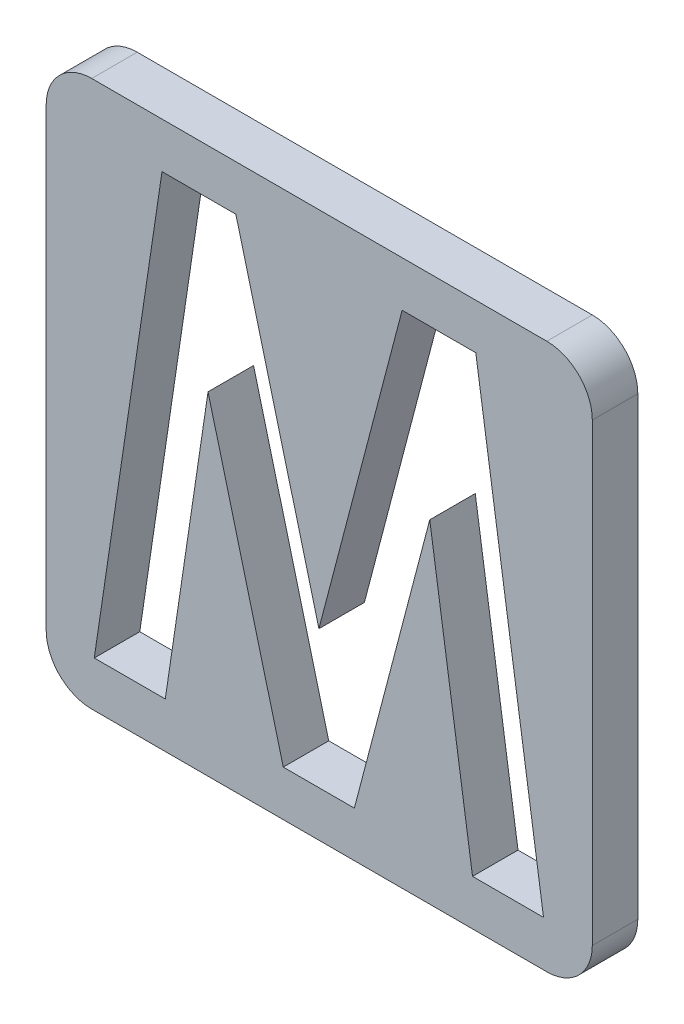
ISO-10303-21;
HEADER;
FILE_DESCRIPTION(('STEP AP214'),'2;1');
FILE_NAME('part.step','',(''),(''),'','','');
FILE_SCHEMA(('AUTOMOTIVE_DESIGN { 1 0 10303 214 1 1 1 1 }'));
ENDSEC;
DATA;
#1=APPLICATION_CONTEXT('core data for automotive mechanical design processes');
#2=APPLICATION_PROTOCOL_DEFINITION('international standard','automotive_design',2000,#1);
#3=PRODUCT_CONTEXT('',#1,'mechanical');
#4=PRODUCT('Part','Part','',(#3));
#5=PRODUCT_RELATED_PRODUCT_CATEGORY('part','',(#4));
#6=PRODUCT_DEFINITION_FORMATION('','',#4);
#7=PRODUCT_DEFINITION_CONTEXT('part definition',#1,'design');
#8=PRODUCT_DEFINITION('design','',#6,#7);
#9=PRODUCT_DEFINITION_SHAPE('','',#8);
#10=(LENGTH_UNIT() NAMED_UNIT(*) SI_UNIT(.MILLI.,.METRE.));
#11=(NAMED_UNIT(*) PLANE_ANGLE_UNIT() SI_UNIT($,.RADIAN.));
#12=(NAMED_UNIT(*) SI_UNIT($,.STERADIAN.) SOLID_ANGLE_UNIT());
#13=UNCERTAINTY_MEASURE_WITH_UNIT(LENGTH_MEASURE(1.E-05),#10,'distance_accuracy_value','');
#14=(GEOMETRIC_REPRESENTATION_CONTEXT(3) GLOBAL_UNCERTAINTY_ASSIGNED_CONTEXT((#13)) GLOBAL_UNIT_ASSIGNED_CONTEXT((#10,
#11,#12)) REPRESENTATION_CONTEXT('',''));
#15=CARTESIAN_POINT('',(0.,0.,0.));
#16=DIRECTION('',(0.,0.,1.));
#17=DIRECTION('',(1.,0.,0.));
#18=AXIS2_PLACEMENT_3D('',#15,#16,#17);
#19=CARTESIAN_POINT('',(50.,50.,10.));
#20=DIRECTION('',(0.,0.,-1.));
#21=DIRECTION('',(-1.,0.,0.));
#22=AXIS2_PLACEMENT_3D('',#19,#20,#21);
#23=PLANE('',#22);
#24=DIRECTION('',(1.,0.,0.));
#25=VECTOR('',#24,1.);
#26=CARTESIAN_POINT('',(-49.9999999999999,60.,10.));
#27=LINE('',#26,#25);
#28=CARTESIAN_POINT('',(-49.9999999999999,60.,10.));
#29=VERTEX_POINT('',#28);
#30=CARTESIAN_POINT('',(49.9999999999999,60.,10.));
#31=VERTEX_POINT('',#30);
#32=EDGE_CURVE('E278',#29,#31,#27,.T.);
#33=ORIENTED_EDGE('',*,*,#32,.F.);
#34=CARTESIAN_POINT('',(-50.,50.,10.));
#35=DIRECTION('',(0.,0.,1.));
#36=DIRECTION('',(1.,0.,0.));
#37=AXIS2_PLACEMENT_3D('',#34,#35,#36);
#38=CIRCLE('',#37,10.);
#39=CARTESIAN_POINT('',(-60.,49.9999999999999,10.));
#40=VERTEX_POINT('',#39);
#41=EDGE_CURVE('E296',#29,#40,#38,.T.);
#42=ORIENTED_EDGE('',*,*,#41,.T.);
#43=DIRECTION('',(0.,-1.,0.));
#44=VECTOR('',#43,1.);
#45=CARTESIAN_POINT('',(-60.,49.9999999999999,10.));
#46=LINE('',#45,#44);
#47=CARTESIAN_POINT('',(-60.,-49.9999999999999,10.));
#48=VERTEX_POINT('',#47);
#49=EDGE_CURVE('E294',#40,#48,#46,.T.);
#50=ORIENTED_EDGE('',*,*,#49,.T.);
#51=CARTESIAN_POINT('',(-50.,-50.,10.));
#52=DIRECTION('',(0.,0.,1.));
#53=DIRECTION('',(1.,0.,0.));
#54=AXIS2_PLACEMENT_3D('',#51,#52,#53);
#55=CIRCLE('',#54,10.);
#56=CARTESIAN_POINT('',(-49.9999999999999,-60.,10.));
#57=VERTEX_POINT('',#56);
#58=EDGE_CURVE('E292',#48,#57,#55,.T.);
#59=ORIENTED_EDGE('',*,*,#58,.T.);
#60=DIRECTION('',(1.,0.,0.));
#61=VECTOR('',#60,1.);
#62=CARTESIAN_POINT('',(-49.9999999999999,-60.,10.));
#63=LINE('',#62,#61);
#64=CARTESIAN_POINT('',(49.9999999999999,-60.,10.));
#65=VERTEX_POINT('',#64);
#66=EDGE_CURVE('E290',#57,#65,#63,.T.);
#67=ORIENTED_EDGE('',*,*,#66,.T.);
#68=CARTESIAN_POINT('',(50.,-50.,10.));
#69=DIRECTION('',(0.,0.,1.));
#70=DIRECTION('',(1.,0.,0.));
#71=AXIS2_PLACEMENT_3D('',#68,#69,#70);
#72=CIRCLE('',#71,10.);
#73=CARTESIAN_POINT('',(60.,-50.,10.));
#74=VERTEX_POINT('',#73);
#75=EDGE_CURVE('E288',#65,#74,#72,.T.);
#76=ORIENTED_EDGE('',*,*,#75,.T.);
#77=DIRECTION('',(0.,-1.,0.));
#78=VECTOR('',#77,1.);
#79=CARTESIAN_POINT('',(60.,49.9999999999999,10.));
#80=LINE('',#79,#78);
#81=CARTESIAN_POINT('',(60.,49.9999999999999,10.));
#82=VERTEX_POINT('',#81);
#83=EDGE_CURVE('E285',#82,#74,#80,.T.);
#84=ORIENTED_EDGE('',*,*,#83,.F.);
#85=CARTESIAN_POINT('',(50.,50.,10.));
#86=DIRECTION('',(0.,0.,-1.));
#87=DIRECTION('',(-1.,0.,0.));
#88=AXIS2_PLACEMENT_3D('',#85,#86,#87);
#89=CIRCLE('',#88,10.);
#90=EDGE_CURVE('E281',#31,#82,#89,.T.);
#91=ORIENTED_EDGE('',*,*,#90,.F.);
#92=EDGE_LOOP('',(#33,#42,#50,#59,#67,#76,#84,#91));
#93=FACE_BOUND('',#92,.T.);
#94=DIRECTION('',(0.147216445436516,0.989104300967819,0.));
#95=VECTOR('',#94,1.);
#96=CARTESIAN_POINT('',(-49.4358974358974,-50.,10.));
#97=LINE('',#96,#95);
#98=CARTESIAN_POINT('',(-49.4358974358974,-50.,10.));
#99=VERTEX_POINT('',#98);
#100=CARTESIAN_POINT('',(-34.5520833333333,50.,10.));
#101=VERTEX_POINT('',#100);
#102=EDGE_CURVE('E50',#99,#101,#97,.T.);
#103=ORIENTED_EDGE('',*,*,#102,.T.);
#104=DIRECTION('',(1.,0.,0.));
#105=VECTOR('',#104,1.);
#106=CARTESIAN_POINT('',(-34.5520833333333,50.,10.));
#107=LINE('',#106,#105);
#108=CARTESIAN_POINT('',(-18.3261217948718,50.,10.));
#109=VERTEX_POINT('',#108);
#110=EDGE_CURVE('E192',#101,#109,#107,.T.);
#111=ORIENTED_EDGE('',*,*,#110,.T.);
#112=DIRECTION('',(0.253111760027982,-0.967437045463702,0.));
#113=VECTOR('',#112,1.);
#114=CARTESIAN_POINT('',(-18.3261217948718,50.,10.));
#115=LINE('',#114,#113);
#116=CARTESIAN_POINT('',(-0.0769230769230717,-19.7516025641026,10.));
#117=VERTEX_POINT('',#116);
#118=EDGE_CURVE('E225',#109,#117,#115,.T.);
#119=ORIENTED_EDGE('',*,*,#118,.T.);
#120=DIRECTION('',(0.253631729312339,0.967300855931614,0.));
#121=VECTOR('',#120,1.);
#122=CARTESIAN_POINT('',(-0.0769230769230717,-19.7516025641026,10.));
#123=LINE('',#122,#121);
#124=CARTESIAN_POINT('',(18.2123397435897,50.,10.));
#125=VERTEX_POINT('',#124);
#126=EDGE_CURVE('E228',#117,#125,#123,.T.);
#127=ORIENTED_EDGE('',*,*,#126,.T.);
#128=DIRECTION('',(1.,0.,0.));
#129=VECTOR('',#128,1.);
#130=CARTESIAN_POINT('',(18.2123397435897,50.,10.));
#131=LINE('',#130,#129);
#132=CARTESIAN_POINT('',(34.3982371794872,50.,10.));
#133=VERTEX_POINT('',#132);
#134=EDGE_CURVE('E231',#125,#133,#131,.T.);
#135=ORIENTED_EDGE('',*,*,#134,.T.);
#136=DIRECTION('',(0.147216445436516,-0.989104300967819,0.));
#137=VECTOR('',#136,1.);
#138=CARTESIAN_POINT('',(34.3982371794872,50.,10.));
#139=LINE('',#138,#137);
#140=CARTESIAN_POINT('',(49.2820512820513,-50.,10.));
#141=VERTEX_POINT('',#140);
#142=EDGE_CURVE('E234',#133,#141,#139,.T.);
#143=ORIENTED_EDGE('',*,*,#142,.T.);
#144=DIRECTION('',(-1.,0.,0.));
#145=VECTOR('',#144,1.);
#146=CARTESIAN_POINT('',(49.2820512820513,-50.,10.));
#147=LINE('',#146,#145);
#148=CARTESIAN_POINT('',(33.6770833333333,-50.,10.));
#149=VERTEX_POINT('',#148);
#150=EDGE_CURVE('E237',#141,#149,#147,.T.);
#151=ORIENTED_EDGE('',*,*,#150,.T.);
#152=DIRECTION('',(-0.147128467052664,0.989117391507567,0.));
#153=VECTOR('',#152,1.);
#154=CARTESIAN_POINT('',(33.6770833333333,-50.,10.));
#155=LINE('',#154,#153);
#156=CARTESIAN_POINT('',(24.2820512820513,13.1610576923077,10.));
#157=VERTEX_POINT('',#156);
#158=EDGE_CURVE('E240',#149,#157,#155,.T.);
#159=ORIENTED_EDGE('',*,*,#158,.T.);
#160=DIRECTION('',(-0.253707982893475,-0.967280858601122,0.));
#161=VECTOR('',#160,1.);
#162=CARTESIAN_POINT('',(24.2820512820513,13.1610576923077,10.));
#163=LINE('',#162,#161);
#164=CARTESIAN_POINT('',(7.71554487179488,-50.,10.));
#165=VERTEX_POINT('',#164);
#166=EDGE_CURVE('E243',#157,#165,#163,.T.);
#167=ORIENTED_EDGE('',*,*,#166,.T.);
#168=DIRECTION('',(-1.,0.,0.));
#169=VECTOR('',#168,1.);
#170=CARTESIAN_POINT('',(7.71554487179488,-50.,10.));
#171=LINE('',#170,#169);
#172=CARTESIAN_POINT('',(-7.90945512820512,-50.,10.));
#173=VERTEX_POINT('',#172);
#174=EDGE_CURVE('E246',#165,#173,#171,.T.);
#175=ORIENTED_EDGE('',*,*,#174,.T.);
#176=DIRECTION('',(-0.253133780305343,0.967431284003327,0.));
#177=VECTOR('',#176,1.);
#178=CARTESIAN_POINT('',(-7.90945512820512,-50.,10.));
#179=LINE('',#178,#177);
#180=CARTESIAN_POINT('',(-24.4358974358974,13.1610576923077,10.));
#181=VERTEX_POINT('',#180);
#182=EDGE_CURVE('E249',#173,#181,#179,.T.);
#183=ORIENTED_EDGE('',*,*,#182,.T.);
#184=DIRECTION('',(-0.147128467052664,-0.989117391507567,0.));
#185=VECTOR('',#184,1.);
#186=CARTESIAN_POINT('',(-24.4358974358974,13.1610576923077,10.));
#187=LINE('',#186,#185);
#188=CARTESIAN_POINT('',(-33.8309294871795,-50.,10.));
#189=VERTEX_POINT('',#188);
#190=EDGE_CURVE('E252',#181,#189,#187,.T.);
#191=ORIENTED_EDGE('',*,*,#190,.T.);
#192=DIRECTION('',(-1.,0.,0.));
#193=VECTOR('',#192,1.);
#194=CARTESIAN_POINT('',(-33.8309294871795,-50.,10.));
#195=LINE('',#194,#193);
#196=EDGE_CURVE('E186',#189,#99,#195,.T.);
#197=ORIENTED_EDGE('',*,*,#196,.T.);
#198=EDGE_LOOP('',(#103,#111,#119,#127,#135,#143,#151,#159,#167,#175,#183,#191,#197));
#199=FACE_BOUND('',#198,.T.);
#200=ADVANCED_FACE('F33',(#93,#199),#23,.F.);
#201=CARTESIAN_POINT('',(50.,50.,0.));
#202=DIRECTION('',(0.,0.,-1.));
#203=DIRECTION('',(-1.,0.,0.));
#204=AXIS2_PLACEMENT_3D('',#201,#202,#203);
#205=PLANE('',#204);
#206=DIRECTION('',(1.,0.,0.));
#207=VECTOR('',#206,1.);
#208=CARTESIAN_POINT('',(-49.9999999999999,60.,0.));
#209=LINE('',#208,#207);
#210=CARTESIAN_POINT('',(-49.9999999999999,60.,0.));
#211=VERTEX_POINT('',#210);
#212=CARTESIAN_POINT('',(49.9999999999999,60.,0.));
#213=VERTEX_POINT('',#212);
#214=EDGE_CURVE('E193',#211,#213,#209,.T.);
#215=ORIENTED_EDGE('',*,*,#214,.T.);
#216=CARTESIAN_POINT('',(50.,50.,0.));
#217=DIRECTION('',(0.,0.,-1.));
#218=DIRECTION('',(-1.,0.,0.));
#219=AXIS2_PLACEMENT_3D('',#216,#217,#218);
#220=CIRCLE('',#219,10.);
#221=CARTESIAN_POINT('',(60.,49.9999999999999,0.));
#222=VERTEX_POINT('',#221);
#223=EDGE_CURVE('E300',#213,#222,#220,.T.);
#224=ORIENTED_EDGE('',*,*,#223,.T.);
#225=DIRECTION('',(0.,-1.,0.));
#226=VECTOR('',#225,1.);
#227=CARTESIAN_POINT('',(60.,49.9999999999999,0.));
#228=LINE('',#227,#226);
#229=CARTESIAN_POINT('',(60.,-50.,0.));
#230=VERTEX_POINT('',#229);
#231=EDGE_CURVE('E303',#222,#230,#228,.T.);
#232=ORIENTED_EDGE('',*,*,#231,.T.);
#233=CARTESIAN_POINT('',(50.,-50.,0.));
#234=DIRECTION('',(0.,0.,1.));
#235=DIRECTION('',(1.,0.,0.));
#236=AXIS2_PLACEMENT_3D('',#233,#234,#235);
#237=CIRCLE('',#236,10.);
#238=CARTESIAN_POINT('',(49.9999999999999,-60.,0.));
#239=VERTEX_POINT('',#238);
#240=EDGE_CURVE('E306',#239,#230,#237,.T.);
#241=ORIENTED_EDGE('',*,*,#240,.F.);
#242=DIRECTION('',(1.,0.,0.));
#243=VECTOR('',#242,1.);
#244=CARTESIAN_POINT('',(-49.9999999999999,-60.,0.));
#245=LINE('',#244,#243);
#246=CARTESIAN_POINT('',(-49.9999999999999,-60.,0.));
#247=VERTEX_POINT('',#246);
#248=EDGE_CURVE('E309',#247,#239,#245,.T.);
#249=ORIENTED_EDGE('',*,*,#248,.F.);
#250=CARTESIAN_POINT('',(-50.,-50.,0.));
#251=DIRECTION('',(0.,0.,1.));
#252=DIRECTION('',(1.,0.,0.));
#253=AXIS2_PLACEMENT_3D('',#250,#251,#252);
#254=CIRCLE('',#253,10.);
#255=CARTESIAN_POINT('',(-60.,-49.9999999999999,0.));
#256=VERTEX_POINT('',#255);
#257=EDGE_CURVE('E311',#256,#247,#254,.T.);
#258=ORIENTED_EDGE('',*,*,#257,.F.);
#259=DIRECTION('',(0.,-1.,0.));
#260=VECTOR('',#259,1.);
#261=CARTESIAN_POINT('',(-60.,49.9999999999999,0.));
#262=LINE('',#261,#260);
#263=CARTESIAN_POINT('',(-60.,49.9999999999999,0.));
#264=VERTEX_POINT('',#263);
#265=EDGE_CURVE('E313',#264,#256,#262,.T.);
#266=ORIENTED_EDGE('',*,*,#265,.F.);
#267=CARTESIAN_POINT('',(-50.,50.,0.));
#268=DIRECTION('',(0.,0.,1.));
#269=DIRECTION('',(1.,0.,0.));
#270=AXIS2_PLACEMENT_3D('',#267,#268,#269);
#271=CIRCLE('',#270,10.);
#272=EDGE_CURVE('E282',#211,#264,#271,.T.);
#273=ORIENTED_EDGE('',*,*,#272,.F.);
#274=EDGE_LOOP('',(#215,#224,#232,#241,#249,#258,#266,#273));
#275=FACE_BOUND('',#274,.T.);
#276=DIRECTION('',(1.,0.,0.));
#277=VECTOR('',#276,1.);
#278=CARTESIAN_POINT('',(-34.5520833333333,50.,0.));
#279=LINE('',#278,#277);
#280=CARTESIAN_POINT('',(-34.5520833333333,50.,0.));
#281=VERTEX_POINT('',#280);
#282=CARTESIAN_POINT('',(-18.3261217948718,50.,0.));
#283=VERTEX_POINT('',#282);
#284=EDGE_CURVE('E185',#281,#283,#279,.T.);
#285=ORIENTED_EDGE('',*,*,#284,.F.);
#286=DIRECTION('',(0.147216445436516,0.989104300967819,0.));
#287=VECTOR('',#286,1.);
#288=CARTESIAN_POINT('',(-49.4358974358974,-50.,0.));
#289=LINE('',#288,#287);
#290=CARTESIAN_POINT('',(-49.4358974358974,-50.,0.));
#291=VERTEX_POINT('',#290);
#292=EDGE_CURVE('E177',#291,#281,#289,.T.);
#293=ORIENTED_EDGE('',*,*,#292,.F.);
#294=DIRECTION('',(-1.,0.,0.));
#295=VECTOR('',#294,1.);
#296=CARTESIAN_POINT('',(-33.8309294871795,-50.,0.));
#297=LINE('',#296,#295);
#298=CARTESIAN_POINT('',(-33.8309294871795,-50.,0.));
#299=VERTEX_POINT('',#298);
#300=EDGE_CURVE('E221',#299,#291,#297,.T.);
#301=ORIENTED_EDGE('',*,*,#300,.F.);
#302=DIRECTION('',(-0.147128467052664,-0.989117391507567,0.));
#303=VECTOR('',#302,1.);
#304=CARTESIAN_POINT('',(-24.4358974358974,13.1610576923077,0.));
#305=LINE('',#304,#303);
#306=CARTESIAN_POINT('',(-24.4358974358974,13.1610576923077,0.));
#307=VERTEX_POINT('',#306);
#308=EDGE_CURVE('E219',#307,#299,#305,.T.);
#309=ORIENTED_EDGE('',*,*,#308,.F.);
#310=DIRECTION('',(-0.253133780305343,0.967431284003327,0.));
#311=VECTOR('',#310,1.);
#312=CARTESIAN_POINT('',(-7.90945512820512,-50.,0.));
#313=LINE('',#312,#311);
#314=CARTESIAN_POINT('',(-7.90945512820512,-50.,0.));
#315=VERTEX_POINT('',#314);
#316=EDGE_CURVE('E217',#315,#307,#313,.T.);
#317=ORIENTED_EDGE('',*,*,#316,.F.);
#318=DIRECTION('',(-1.,0.,0.));
#319=VECTOR('',#318,1.);
#320=CARTESIAN_POINT('',(7.71554487179488,-50.,0.));
#321=LINE('',#320,#319);
#322=CARTESIAN_POINT('',(7.71554487179488,-50.,0.));
#323=VERTEX_POINT('',#322);
#324=EDGE_CURVE('E215',#323,#315,#321,.T.);
#325=ORIENTED_EDGE('',*,*,#324,.F.);
#326=DIRECTION('',(-0.253707982893475,-0.967280858601122,0.));
#327=VECTOR('',#326,1.);
#328=CARTESIAN_POINT('',(24.2820512820513,13.1610576923077,0.));
#329=LINE('',#328,#327);
#330=CARTESIAN_POINT('',(24.2820512820513,13.1610576923077,0.));
#331=VERTEX_POINT('',#330);
#332=EDGE_CURVE('E213',#331,#323,#329,.T.);
#333=ORIENTED_EDGE('',*,*,#332,.F.);
#334=DIRECTION('',(-0.147128467052664,0.989117391507567,0.));
#335=VECTOR('',#334,1.);
#336=CARTESIAN_POINT('',(33.6770833333333,-50.,0.));
#337=LINE('',#336,#335);
#338=CARTESIAN_POINT('',(33.6770833333333,-50.,0.));
#339=VERTEX_POINT('',#338);
#340=EDGE_CURVE('E211',#339,#331,#337,.T.);
#341=ORIENTED_EDGE('',*,*,#340,.F.);
#342=DIRECTION('',(-1.,0.,0.));
#343=VECTOR('',#342,1.);
#344=CARTESIAN_POINT('',(49.2820512820513,-50.,0.));
#345=LINE('',#344,#343);
#346=CARTESIAN_POINT('',(49.2820512820513,-50.,0.));
#347=VERTEX_POINT('',#346);
#348=EDGE_CURVE('E209',#347,#339,#345,.T.);
#349=ORIENTED_EDGE('',*,*,#348,.F.);
#350=DIRECTION('',(0.147216445436516,-0.989104300967819,0.));
#351=VECTOR('',#350,1.);
#352=CARTESIAN_POINT('',(34.3982371794872,50.,0.));
#353=LINE('',#352,#351);
#354=CARTESIAN_POINT('',(34.3982371794872,50.,0.));
#355=VERTEX_POINT('',#354);
#356=EDGE_CURVE('E207',#355,#347,#353,.T.);
#357=ORIENTED_EDGE('',*,*,#356,.F.);
#358=DIRECTION('',(1.,0.,0.));
#359=VECTOR('',#358,1.);
#360=CARTESIAN_POINT('',(18.2123397435897,50.,0.));
#361=LINE('',#360,#359);
#362=CARTESIAN_POINT('',(18.2123397435897,50.,0.));
#363=VERTEX_POINT('',#362);
#364=EDGE_CURVE('E205',#363,#355,#361,.T.);
#365=ORIENTED_EDGE('',*,*,#364,.F.);
#366=DIRECTION('',(0.253631729312339,0.967300855931614,0.));
#367=VECTOR('',#366,1.);
#368=CARTESIAN_POINT('',(-0.0769230769230717,-19.7516025641026,0.));
#369=LINE('',#368,#367);
#370=CARTESIAN_POINT('',(-0.0769230769230717,-19.7516025641026,0.));
#371=VERTEX_POINT('',#370);
#372=EDGE_CURVE('E201',#371,#363,#369,.T.);
#373=ORIENTED_EDGE('',*,*,#372,.F.);
#374=DIRECTION('',(0.253111760027982,-0.967437045463702,0.));
#375=VECTOR('',#374,1.);
#376=CARTESIAN_POINT('',(-18.3261217948718,50.,0.));
#377=LINE('',#376,#375);
#378=EDGE_CURVE('E199',#283,#371,#377,.T.);
#379=ORIENTED_EDGE('',*,*,#378,.F.);
#380=EDGE_LOOP('',(#285,#293,#301,#309,#317,#325,#333,#341,#349,#357,#365,#373,#379));
#381=FACE_BOUND('',#380,.T.);
#382=ADVANCED_FACE('F197',(#275,#381),#205,.T.);
#383=CARTESIAN_POINT('',(-49.9999999999999,60.,10.));
#384=DIRECTION('',(0.,1.,0.));
#385=DIRECTION('',(0.,0.,1.));
#386=AXIS2_PLACEMENT_3D('',#383,#384,#385);
#387=PLANE('',#386);
#388=ORIENTED_EDGE('',*,*,#214,.F.);
#389=DIRECTION('',(0.,0.,-1.));
#390=VECTOR('',#389,1.);
#391=CARTESIAN_POINT('',(-49.9999999999999,60.,10.));
#392=LINE('',#391,#390);
#393=EDGE_CURVE('E11',#29,#211,#392,.T.);
#394=ORIENTED_EDGE('',*,*,#393,.F.);
#395=ORIENTED_EDGE('',*,*,#32,.T.);
#396=DIRECTION('',(0.,0.,-1.));
#397=VECTOR('',#396,1.);
#398=CARTESIAN_POINT('',(49.9999999999999,60.,10.));
#399=LINE('',#398,#397);
#400=EDGE_CURVE('E37',#31,#213,#399,.T.);
#401=ORIENTED_EDGE('',*,*,#400,.T.);
#402=EDGE_LOOP('',(#388,#394,#395,#401));
#403=FACE_BOUND('',#402,.T.);
#404=ADVANCED_FACE('F35',(#403),#387,.T.);
#405=CARTESIAN_POINT('',(-50.,50.,10.));
#406=DIRECTION('',(0.,0.,-1.));
#407=DIRECTION('',(-1.,0.,0.));
#408=AXIS2_PLACEMENT_3D('',#405,#406,#407);
#409=CYLINDRICAL_SURFACE('',#408,10.);
#410=ORIENTED_EDGE('',*,*,#272,.T.);
#411=DIRECTION('',(0.,0.,-1.));
#412=VECTOR('',#411,1.);
#413=CARTESIAN_POINT('',(-60.,49.9999999999999,10.));
#414=LINE('',#413,#412);
#415=EDGE_CURVE('E42',#40,#264,#414,.T.);
#416=ORIENTED_EDGE('',*,*,#415,.F.);
#417=ORIENTED_EDGE('',*,*,#41,.F.);
#418=ORIENTED_EDGE('',*,*,#393,.T.);
#419=EDGE_LOOP('',(#410,#416,#417,#418));
#420=FACE_BOUND('',#419,.T.);
#421=ADVANCED_FACE('F343',(#420),#409,.T.);
#422=CARTESIAN_POINT('',(-60.,49.9999999999999,10.));
#423=DIRECTION('',(1.,0.,0.));
#424=DIRECTION('',(0.,1.,0.));
#425=AXIS2_PLACEMENT_3D('',#422,#423,#424);
#426=PLANE('',#425);
#427=ORIENTED_EDGE('',*,*,#265,.T.);
#428=DIRECTION('',(0.,0.,-1.));
#429=VECTOR('',#428,1.);
#430=CARTESIAN_POINT('',(-60.,-49.9999999999999,10.));
#431=LINE('',#430,#429);
#432=EDGE_CURVE('E318',#48,#256,#431,.T.);
#433=ORIENTED_EDGE('',*,*,#432,.F.);
#434=ORIENTED_EDGE('',*,*,#49,.F.);
#435=ORIENTED_EDGE('',*,*,#415,.T.);
#436=EDGE_LOOP('',(#427,#433,#434,#435));
#437=FACE_BOUND('',#436,.T.);
#438=ADVANCED_FACE('F347',(#437),#426,.F.);
#439=CARTESIAN_POINT('',(-50.,-50.,10.));
#440=DIRECTION('',(0.,0.,-1.));
#441=DIRECTION('',(-1.,0.,0.));
#442=AXIS2_PLACEMENT_3D('',#439,#440,#441);
#443=CYLINDRICAL_SURFACE('',#442,10.);
#444=ORIENTED_EDGE('',*,*,#257,.T.);
#445=DIRECTION('',(0.,0.,-1.));
#446=VECTOR('',#445,1.);
#447=CARTESIAN_POINT('',(-49.9999999999999,-60.,10.));
#448=LINE('',#447,#446);
#449=EDGE_CURVE('E321',#57,#247,#448,.T.);
#450=ORIENTED_EDGE('',*,*,#449,.F.);
#451=ORIENTED_EDGE('',*,*,#58,.F.);
#452=ORIENTED_EDGE('',*,*,#432,.T.);
#453=EDGE_LOOP('',(#444,#450,#451,#452));
#454=FACE_BOUND('',#453,.T.);
#455=ADVANCED_FACE('F367',(#454),#443,.T.);
#456=CARTESIAN_POINT('',(-49.9999999999999,-60.,10.));
#457=DIRECTION('',(0.,1.,0.));
#458=DIRECTION('',(0.,0.,1.));
#459=AXIS2_PLACEMENT_3D('',#456,#457,#458);
#460=PLANE('',#459);
#461=ORIENTED_EDGE('',*,*,#248,.T.);
#462=DIRECTION('',(0.,0.,-1.));
#463=VECTOR('',#462,1.);
#464=CARTESIAN_POINT('',(49.9999999999999,-60.,10.));
#465=LINE('',#464,#463);
#466=EDGE_CURVE('E324',#65,#239,#465,.T.);
#467=ORIENTED_EDGE('',*,*,#466,.F.);
#468=ORIENTED_EDGE('',*,*,#66,.F.);
#469=ORIENTED_EDGE('',*,*,#449,.T.);
#470=EDGE_LOOP('',(#461,#467,#468,#469));
#471=FACE_BOUND('',#470,.T.);
#472=ADVANCED_FACE('F365',(#471),#460,.F.);
#473=CARTESIAN_POINT('',(50.,-50.,10.));
#474=DIRECTION('',(0.,0.,-1.));
#475=DIRECTION('',(-1.,0.,0.));
#476=AXIS2_PLACEMENT_3D('',#473,#474,#475);
#477=CYLINDRICAL_SURFACE('',#476,10.);
#478=ORIENTED_EDGE('',*,*,#240,.T.);
#479=DIRECTION('',(0.,0.,-1.));
#480=VECTOR('',#479,1.);
#481=CARTESIAN_POINT('',(60.,-50.,10.));
#482=LINE('',#481,#480);
#483=EDGE_CURVE('E327',#74,#230,#482,.T.);
#484=ORIENTED_EDGE('',*,*,#483,.F.);
#485=ORIENTED_EDGE('',*,*,#75,.F.);
#486=ORIENTED_EDGE('',*,*,#466,.T.);
#487=EDGE_LOOP('',(#478,#484,#485,#486));
#488=FACE_BOUND('',#487,.T.);
#489=ADVANCED_FACE('F361',(#488),#477,.T.);
#490=CARTESIAN_POINT('',(60.,49.9999999999999,10.));
#491=DIRECTION('',(1.,0.,0.));
#492=DIRECTION('',(0.,1.,0.));
#493=AXIS2_PLACEMENT_3D('',#490,#491,#492);
#494=PLANE('',#493);
#495=ORIENTED_EDGE('',*,*,#231,.F.);
#496=DIRECTION('',(0.,0.,-1.));
#497=VECTOR('',#496,1.);
#498=CARTESIAN_POINT('',(60.,49.9999999999999,10.));
#499=LINE('',#498,#497);
#500=EDGE_CURVE('E328',#82,#222,#499,.T.);
#501=ORIENTED_EDGE('',*,*,#500,.F.);
#502=ORIENTED_EDGE('',*,*,#83,.T.);
#503=ORIENTED_EDGE('',*,*,#483,.T.);
#504=EDGE_LOOP('',(#495,#501,#502,#503));
#505=FACE_BOUND('',#504,.T.);
#506=ADVANCED_FACE('F357',(#505),#494,.T.);
#507=CARTESIAN_POINT('',(50.,50.,10.));
#508=DIRECTION('',(0.,0.,-1.));
#509=DIRECTION('',(-1.,0.,0.));
#510=AXIS2_PLACEMENT_3D('',#507,#508,#509);
#511=CYLINDRICAL_SURFACE('',#510,10.);
#512=ORIENTED_EDGE('',*,*,#223,.F.);
#513=ORIENTED_EDGE('',*,*,#400,.F.);
#514=ORIENTED_EDGE('',*,*,#90,.T.);
#515=ORIENTED_EDGE('',*,*,#500,.T.);
#516=EDGE_LOOP('',(#512,#513,#514,#515));
#517=FACE_BOUND('',#516,.T.);
#518=ADVANCED_FACE('F336',(#517),#511,.T.);
#519=CARTESIAN_POINT('',(-49.4358974358974,-50.,0.));
#520=DIRECTION('',(0.989104300967819,-0.147216445436516,0.));
#521=DIRECTION('',(0.147216445436516,0.989104300967819,0.));
#522=AXIS2_PLACEMENT_3D('',#519,#520,#521);
#523=PLANE('',#522);
#524=ORIENTED_EDGE('',*,*,#102,.F.);
#525=DIRECTION('',(0.,0.,1.));
#526=VECTOR('',#525,1.);
#527=CARTESIAN_POINT('',(-49.4358974358974,-50.,0.));
#528=LINE('',#527,#526);
#529=EDGE_CURVE('E181',#291,#99,#528,.T.);
#530=ORIENTED_EDGE('',*,*,#529,.F.);
#531=ORIENTED_EDGE('',*,*,#292,.T.);
#532=DIRECTION('',(0.,0.,1.));
#533=VECTOR('',#532,1.);
#534=CARTESIAN_POINT('',(-34.5520833333333,50.,0.));
#535=LINE('',#534,#533);
#536=EDGE_CURVE('E180',#281,#101,#535,.T.);
#537=ORIENTED_EDGE('',*,*,#536,.T.);
#538=EDGE_LOOP('',(#524,#530,#531,#537));
#539=FACE_BOUND('',#538,.T.);
#540=ADVANCED_FACE('F179',(#539),#523,.T.);
#541=CARTESIAN_POINT('',(-34.5520833333333,50.,0.));
#542=DIRECTION('',(0.,-1.,0.));
#543=DIRECTION('',(0.,0.,-1.));
#544=AXIS2_PLACEMENT_3D('',#541,#542,#543);
#545=PLANE('',#544);
#546=ORIENTED_EDGE('',*,*,#110,.F.);
#547=ORIENTED_EDGE('',*,*,#536,.F.);
#548=ORIENTED_EDGE('',*,*,#284,.T.);
#549=DIRECTION('',(0.,0.,1.));
#550=VECTOR('',#549,1.);
#551=CARTESIAN_POINT('',(-18.3261217948718,50.,0.));
#552=LINE('',#551,#550);
#553=EDGE_CURVE('E194',#283,#109,#552,.T.);
#554=ORIENTED_EDGE('',*,*,#553,.T.);
#555=EDGE_LOOP('',(#546,#547,#548,#554));
#556=FACE_BOUND('',#555,.T.);
#557=ADVANCED_FACE('F189',(#556),#545,.T.);
#558=CARTESIAN_POINT('',(-18.3261217948718,50.,0.));
#559=DIRECTION('',(-0.967437045463702,-0.253111760027982,0.));
#560=DIRECTION('',(0.253111760027982,-0.967437045463702,0.));
#561=AXIS2_PLACEMENT_3D('',#558,#559,#560);
#562=PLANE('',#561);
#563=ORIENTED_EDGE('',*,*,#118,.F.);
#564=ORIENTED_EDGE('',*,*,#553,.F.);
#565=ORIENTED_EDGE('',*,*,#378,.T.);
#566=DIRECTION('',(0.,0.,1.));
#567=VECTOR('',#566,1.);
#568=CARTESIAN_POINT('',(-0.0769230769230717,-19.7516025641026,0.));
#569=LINE('',#568,#567);
#570=EDGE_CURVE('E275',#371,#117,#569,.T.);
#571=ORIENTED_EDGE('',*,*,#570,.T.);
#572=EDGE_LOOP('',(#563,#564,#565,#571));
#573=FACE_BOUND('',#572,.T.);
#574=ADVANCED_FACE('F416',(#573),#562,.T.);
#575=CARTESIAN_POINT('',(-0.0769230769230717,-19.7516025641026,0.));
#576=DIRECTION('',(0.967300855931614,-0.253631729312339,0.));
#577=DIRECTION('',(0.253631729312339,0.967300855931614,0.));
#578=AXIS2_PLACEMENT_3D('',#575,#576,#577);
#579=PLANE('',#578);
#580=ORIENTED_EDGE('',*,*,#126,.F.);
#581=ORIENTED_EDGE('',*,*,#570,.F.);
#582=ORIENTED_EDGE('',*,*,#372,.T.);
#583=DIRECTION('',(0.,0.,1.));
#584=VECTOR('',#583,1.);
#585=CARTESIAN_POINT('',(18.2123397435897,50.,0.));
#586=LINE('',#585,#584);
#587=EDGE_CURVE('E273',#363,#125,#586,.T.);
#588=ORIENTED_EDGE('',*,*,#587,.T.);
#589=EDGE_LOOP('',(#580,#581,#582,#588));
#590=FACE_BOUND('',#589,.T.);
#591=ADVANCED_FACE('F424',(#590),#579,.T.);
#592=CARTESIAN_POINT('',(18.2123397435897,50.,0.));
#593=DIRECTION('',(0.,-1.,0.));
#594=DIRECTION('',(0.,0.,-1.));
#595=AXIS2_PLACEMENT_3D('',#592,#593,#594);
#596=PLANE('',#595);
#597=ORIENTED_EDGE('',*,*,#134,.F.);
#598=ORIENTED_EDGE('',*,*,#587,.F.);
#599=ORIENTED_EDGE('',*,*,#364,.T.);
#600=DIRECTION('',(0.,0.,1.));
#601=VECTOR('',#600,1.);
#602=CARTESIAN_POINT('',(34.3982371794872,50.,0.));
#603=LINE('',#602,#601);
#604=EDGE_CURVE('E271',#355,#133,#603,.T.);
#605=ORIENTED_EDGE('',*,*,#604,.T.);
#606=EDGE_LOOP('',(#597,#598,#599,#605));
#607=FACE_BOUND('',#606,.T.);
#608=ADVANCED_FACE('F434',(#607),#596,.T.);
#609=CARTESIAN_POINT('',(34.3982371794872,50.,0.));
#610=DIRECTION('',(-0.989104300967819,-0.147216445436516,0.));
#611=DIRECTION('',(0.147216445436516,-0.989104300967819,0.));
#612=AXIS2_PLACEMENT_3D('',#609,#610,#611);
#613=PLANE('',#612);
#614=ORIENTED_EDGE('',*,*,#142,.F.);
#615=ORIENTED_EDGE('',*,*,#604,.F.);
#616=ORIENTED_EDGE('',*,*,#356,.T.);
#617=DIRECTION('',(0.,0.,1.));
#618=VECTOR('',#617,1.);
#619=CARTESIAN_POINT('',(49.2820512820513,-50.,0.));
#620=LINE('',#619,#618);
#621=EDGE_CURVE('E269',#347,#141,#620,.T.);
#622=ORIENTED_EDGE('',*,*,#621,.T.);
#623=EDGE_LOOP('',(#614,#615,#616,#622));
#624=FACE_BOUND('',#623,.T.);
#625=ADVANCED_FACE('F444',(#624),#613,.T.);
#626=CARTESIAN_POINT('',(49.2820512820513,-50.,0.));
#627=DIRECTION('',(0.,1.,0.));
#628=DIRECTION('',(0.,0.,1.));
#629=AXIS2_PLACEMENT_3D('',#626,#627,#628);
#630=PLANE('',#629);
#631=ORIENTED_EDGE('',*,*,#150,.F.);
#632=ORIENTED_EDGE('',*,*,#621,.F.);
#633=ORIENTED_EDGE('',*,*,#348,.T.);
#634=DIRECTION('',(0.,0.,1.));
#635=VECTOR('',#634,1.);
#636=CARTESIAN_POINT('',(33.6770833333333,-50.,0.));
#637=LINE('',#636,#635);
#638=EDGE_CURVE('E267',#339,#149,#637,.T.);
#639=ORIENTED_EDGE('',*,*,#638,.T.);
#640=EDGE_LOOP('',(#631,#632,#633,#639));
#641=FACE_BOUND('',#640,.T.);
#642=ADVANCED_FACE('F454',(#641),#630,.T.);
#643=CARTESIAN_POINT('',(33.6770833333333,-50.,0.));
#644=DIRECTION('',(0.989117391507567,0.147128467052664,0.));
#645=DIRECTION('',(-0.147128467052664,0.989117391507567,0.));
#646=AXIS2_PLACEMENT_3D('',#643,#644,#645);
#647=PLANE('',#646);
#648=ORIENTED_EDGE('',*,*,#158,.F.);
#649=ORIENTED_EDGE('',*,*,#638,.F.);
#650=ORIENTED_EDGE('',*,*,#340,.T.);
#651=DIRECTION('',(0.,0.,1.));
#652=VECTOR('',#651,1.);
#653=CARTESIAN_POINT('',(24.2820512820513,13.1610576923077,0.));
#654=LINE('',#653,#652);
#655=EDGE_CURVE('E265',#331,#157,#654,.T.);
#656=ORIENTED_EDGE('',*,*,#655,.T.);
#657=EDGE_LOOP('',(#648,#649,#650,#656));
#658=FACE_BOUND('',#657,.T.);
#659=ADVANCED_FACE('F464',(#658),#647,.T.);
#660=CARTESIAN_POINT('',(24.2820512820513,13.1610576923077,0.));
#661=DIRECTION('',(-0.967280858601122,0.253707982893475,0.));
#662=DIRECTION('',(-0.253707982893476,-0.967280858601122,0.));
#663=AXIS2_PLACEMENT_3D('',#660,#661,#662);
#664=PLANE('',#663);
#665=ORIENTED_EDGE('',*,*,#166,.F.);
#666=ORIENTED_EDGE('',*,*,#655,.F.);
#667=ORIENTED_EDGE('',*,*,#332,.T.);
#668=DIRECTION('',(0.,0.,1.));
#669=VECTOR('',#668,1.);
#670=CARTESIAN_POINT('',(7.71554487179488,-50.,0.));
#671=LINE('',#670,#669);
#672=EDGE_CURVE('E263',#323,#165,#671,.T.);
#673=ORIENTED_EDGE('',*,*,#672,.T.);
#674=EDGE_LOOP('',(#665,#666,#667,#673));
#675=FACE_BOUND('',#674,.T.);
#676=ADVANCED_FACE('F474',(#675),#664,.T.);
#677=CARTESIAN_POINT('',(7.71554487179488,-50.,0.));
#678=DIRECTION('',(0.,1.,0.));
#679=DIRECTION('',(0.,0.,1.));
#680=AXIS2_PLACEMENT_3D('',#677,#678,#679);
#681=PLANE('',#680);
#682=ORIENTED_EDGE('',*,*,#174,.F.);
#683=ORIENTED_EDGE('',*,*,#672,.F.);
#684=ORIENTED_EDGE('',*,*,#324,.T.);
#685=DIRECTION('',(0.,0.,1.));
#686=VECTOR('',#685,1.);
#687=CARTESIAN_POINT('',(-7.90945512820512,-50.,0.));
#688=LINE('',#687,#686);
#689=EDGE_CURVE('E261',#315,#173,#688,.T.);
#690=ORIENTED_EDGE('',*,*,#689,.T.);
#691=EDGE_LOOP('',(#682,#683,#684,#690));
#692=FACE_BOUND('',#691,.T.);
#693=ADVANCED_FACE('F484',(#692),#681,.T.);
#694=CARTESIAN_POINT('',(-7.90945512820512,-50.,0.));
#695=DIRECTION('',(0.967431284003327,0.253133780305343,0.));
#696=DIRECTION('',(-0.253133780305343,0.967431284003327,0.));
#697=AXIS2_PLACEMENT_3D('',#694,#695,#696);
#698=PLANE('',#697);
#699=ORIENTED_EDGE('',*,*,#182,.F.);
#700=ORIENTED_EDGE('',*,*,#689,.F.);
#701=ORIENTED_EDGE('',*,*,#316,.T.);
#702=DIRECTION('',(0.,0.,1.));
#703=VECTOR('',#702,1.);
#704=CARTESIAN_POINT('',(-24.4358974358974,13.1610576923077,0.));
#705=LINE('',#704,#703);
#706=EDGE_CURVE('E259',#307,#181,#705,.T.);
#707=ORIENTED_EDGE('',*,*,#706,.T.);
#708=EDGE_LOOP('',(#699,#700,#701,#707));
#709=FACE_BOUND('',#708,.T.);
#710=ADVANCED_FACE('F494',(#709),#698,.T.);
#711=CARTESIAN_POINT('',(-24.4358974358974,13.1610576923077,0.));
#712=DIRECTION('',(-0.989117391507567,0.147128467052664,0.));
#713=DIRECTION('',(-0.147128467052664,-0.989117391507567,0.));
#714=AXIS2_PLACEMENT_3D('',#711,#712,#713);
#715=PLANE('',#714);
#716=ORIENTED_EDGE('',*,*,#190,.F.);
#717=ORIENTED_EDGE('',*,*,#706,.F.);
#718=ORIENTED_EDGE('',*,*,#308,.T.);
#719=DIRECTION('',(0.,0.,1.));
#720=VECTOR('',#719,1.);
#721=CARTESIAN_POINT('',(-33.8309294871795,-50.,0.));
#722=LINE('',#721,#720);
#723=EDGE_CURVE('E58',#299,#189,#722,.T.);
#724=ORIENTED_EDGE('',*,*,#723,.T.);
#725=EDGE_LOOP('',(#716,#717,#718,#724));
#726=FACE_BOUND('',#725,.T.);
#727=ADVANCED_FACE('F504',(#726),#715,.T.);
#728=CARTESIAN_POINT('',(-33.8309294871795,-50.,0.));
#729=DIRECTION('',(0.,1.,0.));
#730=DIRECTION('',(0.,0.,1.));
#731=AXIS2_PLACEMENT_3D('',#728,#729,#730);
#732=PLANE('',#731);
#733=ORIENTED_EDGE('',*,*,#196,.F.);
#734=ORIENTED_EDGE('',*,*,#723,.F.);
#735=ORIENTED_EDGE('',*,*,#300,.T.);
#736=ORIENTED_EDGE('',*,*,#529,.T.);
#737=EDGE_LOOP('',(#733,#734,#735,#736));
#738=FACE_BOUND('',#737,.T.);
#739=ADVANCED_FACE('F514',(#738),#732,.T.);
#740=CLOSED_SHELL('',(#200,#382,#404,#421,#438,#455,#472,#489,#506,#518,#540,#557,#574,#591,
#608,#625,#642,#659,#676,#693,#710,#727,#739));
#741=MANIFOLD_SOLID_BREP('B2',#740);
#742=ADVANCED_BREP_SHAPE_REPRESENTATION('',(#18,#741),#14);
#743=SHAPE_DEFINITION_REPRESENTATION(#9,#742);
ENDSEC;
END-ISO-10303-21;
